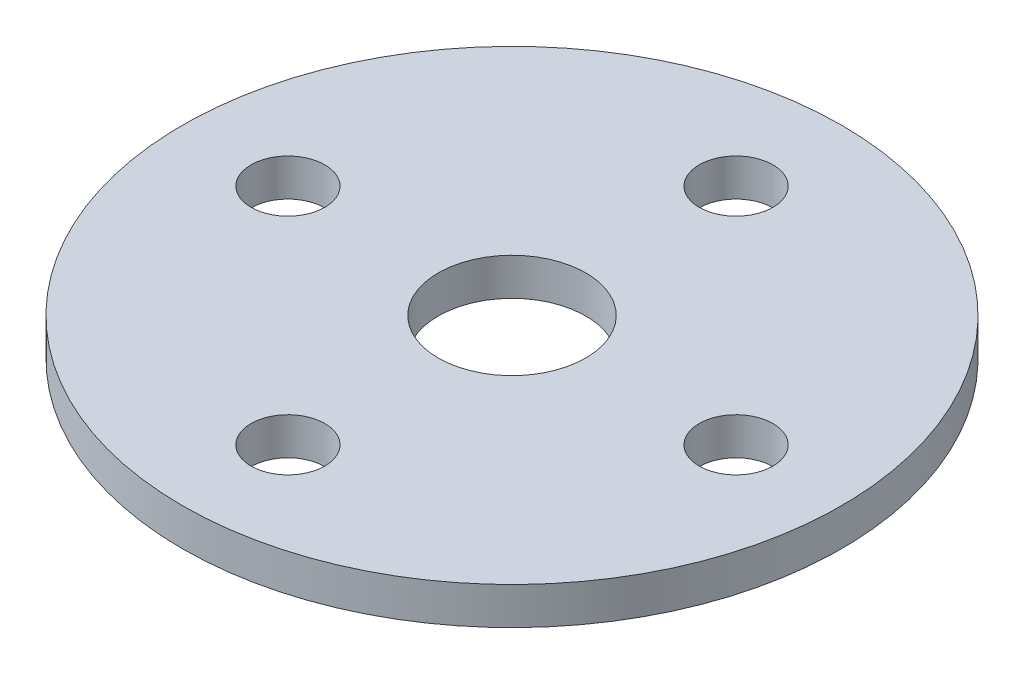
ISO-10303-21;
HEADER;
FILE_DESCRIPTION(('STEP AP214'),'2;1');
FILE_NAME('part.step','',(''),(''),'','','');
FILE_SCHEMA(('AUTOMOTIVE_DESIGN { 1 0 10303 214 1 1 1 1 }'));
ENDSEC;
DATA;
#1=APPLICATION_CONTEXT('core data for automotive mechanical design processes');
#2=APPLICATION_PROTOCOL_DEFINITION('international standard','automotive_design',2000,#1);
#3=PRODUCT_CONTEXT('',#1,'mechanical');
#4=PRODUCT('Part','Part','',(#3));
#5=PRODUCT_RELATED_PRODUCT_CATEGORY('part','',(#4));
#6=PRODUCT_DEFINITION_FORMATION('','',#4);
#7=PRODUCT_DEFINITION_CONTEXT('part definition',#1,'design');
#8=PRODUCT_DEFINITION('design','',#6,#7);
#9=PRODUCT_DEFINITION_SHAPE('','',#8);
#10=(LENGTH_UNIT() NAMED_UNIT(*) SI_UNIT(.MILLI.,.METRE.));
#11=(NAMED_UNIT(*) PLANE_ANGLE_UNIT() SI_UNIT($,.RADIAN.));
#12=(NAMED_UNIT(*) SI_UNIT($,.STERADIAN.) SOLID_ANGLE_UNIT());
#13=UNCERTAINTY_MEASURE_WITH_UNIT(LENGTH_MEASURE(1.E-05),#10,'distance_accuracy_value','');
#14=(GEOMETRIC_REPRESENTATION_CONTEXT(3) GLOBAL_UNCERTAINTY_ASSIGNED_CONTEXT((#13)) GLOBAL_UNIT_ASSIGNED_CONTEXT((#10,
#11,#12)) REPRESENTATION_CONTEXT('',''));
#15=CARTESIAN_POINT('',(0.,0.,0.));
#16=DIRECTION('',(0.,0.,1.));
#17=DIRECTION('',(1.,0.,0.));
#18=AXIS2_PLACEMENT_3D('',#15,#16,#17);
#19=CARTESIAN_POINT('',(0.,2.,0.));
#20=DIRECTION('',(0.,1.,0.));
#21=DIRECTION('',(0.,0.,1.));
#22=AXIS2_PLACEMENT_3D('',#19,#20,#21);
#23=PLANE('',#22);
#24=CARTESIAN_POINT('',(12.,2.,0.));
#25=DIRECTION('',(0.,1.,0.));
#26=DIRECTION('',(0.,0.,-1.));
#27=AXIS2_PLACEMENT_3D('',#24,#25,#26);
#28=CIRCLE('',#27,1.975);
#29=CARTESIAN_POINT('',(12.,2.,-1.975));
#30=VERTEX_POINT('',#29);
#31=EDGE_CURVE('E62',#30,#30,#28,.T.);
#32=ORIENTED_EDGE('',*,*,#31,.F.);
#33=EDGE_LOOP('',(#32));
#34=FACE_BOUND('',#33,.T.);
#35=CARTESIAN_POINT('',(0.,2.,-12.));
#36=DIRECTION('',(0.,1.,0.));
#37=DIRECTION('',(0.,0.,1.));
#38=AXIS2_PLACEMENT_3D('',#35,#36,#37);
#39=CIRCLE('',#38,1.975);
#40=CARTESIAN_POINT('',(0.,2.,-10.025));
#41=VERTEX_POINT('',#40);
#42=EDGE_CURVE('E50',#41,#41,#39,.T.);
#43=ORIENTED_EDGE('',*,*,#42,.F.);
#44=EDGE_LOOP('',(#43));
#45=FACE_BOUND('',#44,.T.);
#46=CARTESIAN_POINT('',(0.,2.,0.));
#47=DIRECTION('',(0.,1.,0.));
#48=DIRECTION('',(0.,0.,1.));
#49=AXIS2_PLACEMENT_3D('',#46,#47,#48);
#50=CIRCLE('',#49,17.65);
#51=CARTESIAN_POINT('',(0.,2.,17.65));
#52=VERTEX_POINT('',#51);
#53=EDGE_CURVE('E10',#52,#52,#50,.T.);
#54=ORIENTED_EDGE('',*,*,#53,.T.);
#55=EDGE_LOOP('',(#54));
#56=FACE_BOUND('',#55,.T.);
#57=CARTESIAN_POINT('',(0.,2.,0.));
#58=DIRECTION('',(0.,1.,0.));
#59=DIRECTION('',(0.,0.,1.));
#60=AXIS2_PLACEMENT_3D('',#57,#58,#59);
#61=CIRCLE('',#60,3.95);
#62=CARTESIAN_POINT('',(0.,2.,3.95));
#63=VERTEX_POINT('',#62);
#64=EDGE_CURVE('E45',#63,#63,#61,.T.);
#65=ORIENTED_EDGE('',*,*,#64,.F.);
#66=EDGE_LOOP('',(#65));
#67=FACE_BOUND('',#66,.T.);
#68=CARTESIAN_POINT('',(-12.,2.,0.));
#69=DIRECTION('',(0.,1.,0.));
#70=DIRECTION('',(0.,0.,1.));
#71=AXIS2_PLACEMENT_3D('',#68,#69,#70);
#72=CIRCLE('',#71,1.975);
#73=CARTESIAN_POINT('',(-12.,2.,1.975));
#74=VERTEX_POINT('',#73);
#75=EDGE_CURVE('E56',#74,#74,#72,.T.);
#76=ORIENTED_EDGE('',*,*,#75,.F.);
#77=EDGE_LOOP('',(#76));
#78=FACE_BOUND('',#77,.T.);
#79=CARTESIAN_POINT('',(0.,2.,12.));
#80=DIRECTION('',(0.,1.,0.));
#81=DIRECTION('',(0.,0.,-1.));
#82=AXIS2_PLACEMENT_3D('',#79,#80,#81);
#83=CIRCLE('',#82,1.975);
#84=CARTESIAN_POINT('',(0.,2.,10.025));
#85=VERTEX_POINT('',#84);
#86=EDGE_CURVE('E68',#85,#85,#83,.T.);
#87=ORIENTED_EDGE('',*,*,#86,.F.);
#88=EDGE_LOOP('',(#87));
#89=FACE_BOUND('',#88,.T.);
#90=ADVANCED_FACE('F34',(#34,#45,#56,#67,#78,#89),#23,.T.);
#91=CARTESIAN_POINT('',(0.,0.,0.));
#92=DIRECTION('',(0.,1.,0.));
#93=DIRECTION('',(0.,0.,1.));
#94=AXIS2_PLACEMENT_3D('',#91,#92,#93);
#95=PLANE('',#94);
#96=CARTESIAN_POINT('',(0.,0.,0.));
#97=DIRECTION('',(0.,1.,0.));
#98=DIRECTION('',(0.,0.,1.));
#99=AXIS2_PLACEMENT_3D('',#96,#97,#98);
#100=CIRCLE('',#99,17.65);
#101=CARTESIAN_POINT('',(0.,0.,17.65));
#102=VERTEX_POINT('',#101);
#103=EDGE_CURVE('E38',#102,#102,#100,.T.);
#104=ORIENTED_EDGE('',*,*,#103,.F.);
#105=EDGE_LOOP('',(#104));
#106=FACE_BOUND('',#105,.T.);
#107=CARTESIAN_POINT('',(0.,0.,0.));
#108=DIRECTION('',(0.,1.,0.));
#109=DIRECTION('',(0.,0.,1.));
#110=AXIS2_PLACEMENT_3D('',#107,#108,#109);
#111=CIRCLE('',#110,3.95);
#112=CARTESIAN_POINT('',(0.,0.,3.95));
#113=VERTEX_POINT('',#112);
#114=EDGE_CURVE('E47',#113,#113,#111,.T.);
#115=ORIENTED_EDGE('',*,*,#114,.T.);
#116=EDGE_LOOP('',(#115));
#117=FACE_BOUND('',#116,.T.);
#118=CARTESIAN_POINT('',(0.,0.,-12.));
#119=DIRECTION('',(0.,1.,0.));
#120=DIRECTION('',(0.,0.,1.));
#121=AXIS2_PLACEMENT_3D('',#118,#119,#120);
#122=CIRCLE('',#121,1.975);
#123=CARTESIAN_POINT('',(0.,0.,-10.025));
#124=VERTEX_POINT('',#123);
#125=EDGE_CURVE('E53',#124,#124,#122,.T.);
#126=ORIENTED_EDGE('',*,*,#125,.T.);
#127=EDGE_LOOP('',(#126));
#128=FACE_BOUND('',#127,.T.);
#129=CARTESIAN_POINT('',(-12.,0.,0.));
#130=DIRECTION('',(0.,1.,0.));
#131=DIRECTION('',(0.,0.,1.));
#132=AXIS2_PLACEMENT_3D('',#129,#130,#131);
#133=CIRCLE('',#132,1.975);
#134=CARTESIAN_POINT('',(-12.,0.,1.975));
#135=VERTEX_POINT('',#134);
#136=EDGE_CURVE('E59',#135,#135,#133,.T.);
#137=ORIENTED_EDGE('',*,*,#136,.T.);
#138=EDGE_LOOP('',(#137));
#139=FACE_BOUND('',#138,.T.);
#140=CARTESIAN_POINT('',(12.,0.,0.));
#141=DIRECTION('',(0.,1.,0.));
#142=DIRECTION('',(0.,0.,-1.));
#143=AXIS2_PLACEMENT_3D('',#140,#141,#142);
#144=CIRCLE('',#143,1.975);
#145=CARTESIAN_POINT('',(12.,0.,-1.975));
#146=VERTEX_POINT('',#145);
#147=EDGE_CURVE('E65',#146,#146,#144,.T.);
#148=ORIENTED_EDGE('',*,*,#147,.T.);
#149=EDGE_LOOP('',(#148));
#150=FACE_BOUND('',#149,.T.);
#151=CARTESIAN_POINT('',(0.,0.,12.));
#152=DIRECTION('',(0.,1.,0.));
#153=DIRECTION('',(0.,0.,-1.));
#154=AXIS2_PLACEMENT_3D('',#151,#152,#153);
#155=CIRCLE('',#154,1.975);
#156=CARTESIAN_POINT('',(0.,0.,10.025));
#157=VERTEX_POINT('',#156);
#158=EDGE_CURVE('E71',#157,#157,#155,.T.);
#159=ORIENTED_EDGE('',*,*,#158,.T.);
#160=EDGE_LOOP('',(#159));
#161=FACE_BOUND('',#160,.T.);
#162=ADVANCED_FACE('F81',(#106,#117,#128,#139,#150,#161),#95,.F.);
#163=CARTESIAN_POINT('',(0.,2.,0.));
#164=DIRECTION('',(0.,-1.,0.));
#165=DIRECTION('',(0.,0.,-1.));
#166=AXIS2_PLACEMENT_3D('',#163,#164,#165);
#167=CYLINDRICAL_SURFACE('',#166,17.65);
#168=ORIENTED_EDGE('',*,*,#53,.F.);
#169=EDGE_LOOP('',(#168));
#170=FACE_BOUND('',#169,.T.);
#171=ORIENTED_EDGE('',*,*,#103,.T.);
#172=EDGE_LOOP('',(#171));
#173=FACE_BOUND('',#172,.T.);
#174=ADVANCED_FACE('F36',(#170,#173),#167,.T.);
#175=CARTESIAN_POINT('',(0.,2.,0.));
#176=DIRECTION('',(0.,-1.,0.));
#177=DIRECTION('',(0.,0.,-1.));
#178=AXIS2_PLACEMENT_3D('',#175,#176,#177);
#179=CYLINDRICAL_SURFACE('',#178,3.95);
#180=ORIENTED_EDGE('',*,*,#64,.T.);
#181=EDGE_LOOP('',(#180));
#182=FACE_BOUND('',#181,.T.);
#183=ORIENTED_EDGE('',*,*,#114,.F.);
#184=EDGE_LOOP('',(#183));
#185=FACE_BOUND('',#184,.T.);
#186=ADVANCED_FACE('F91',(#182,#185),#179,.F.);
#187=CARTESIAN_POINT('',(0.,2.,-12.));
#188=DIRECTION('',(0.,-1.,0.));
#189=DIRECTION('',(0.,0.,-1.));
#190=AXIS2_PLACEMENT_3D('',#187,#188,#189);
#191=CYLINDRICAL_SURFACE('',#190,1.975);
#192=ORIENTED_EDGE('',*,*,#42,.T.);
#193=EDGE_LOOP('',(#192));
#194=FACE_BOUND('',#193,.T.);
#195=ORIENTED_EDGE('',*,*,#125,.F.);
#196=EDGE_LOOP('',(#195));
#197=FACE_BOUND('',#196,.T.);
#198=ADVANCED_FACE('F94',(#194,#197),#191,.F.);
#199=CARTESIAN_POINT('',(-12.,2.,0.));
#200=DIRECTION('',(0.,-1.,0.));
#201=DIRECTION('',(0.,0.,-1.));
#202=AXIS2_PLACEMENT_3D('',#199,#200,#201);
#203=CYLINDRICAL_SURFACE('',#202,1.975);
#204=ORIENTED_EDGE('',*,*,#75,.T.);
#205=EDGE_LOOP('',(#204));
#206=FACE_BOUND('',#205,.T.);
#207=ORIENTED_EDGE('',*,*,#136,.F.);
#208=EDGE_LOOP('',(#207));
#209=FACE_BOUND('',#208,.T.);
#210=ADVANCED_FACE('F98',(#206,#209),#203,.F.);
#211=CARTESIAN_POINT('',(12.,2.,0.));
#212=DIRECTION('',(0.,-1.,0.));
#213=DIRECTION('',(0.,0.,-1.));
#214=AXIS2_PLACEMENT_3D('',#211,#212,#213);
#215=CYLINDRICAL_SURFACE('',#214,1.975);
#216=ORIENTED_EDGE('',*,*,#31,.T.);
#217=EDGE_LOOP('',(#216));
#218=FACE_BOUND('',#217,.T.);
#219=ORIENTED_EDGE('',*,*,#147,.F.);
#220=EDGE_LOOP('',(#219));
#221=FACE_BOUND('',#220,.T.);
#222=ADVANCED_FACE('F102',(#218,#221),#215,.F.);
#223=CARTESIAN_POINT('',(0.,2.,12.));
#224=DIRECTION('',(0.,-1.,0.));
#225=DIRECTION('',(0.,0.,-1.));
#226=AXIS2_PLACEMENT_3D('',#223,#224,#225);
#227=CYLINDRICAL_SURFACE('',#226,1.975);
#228=ORIENTED_EDGE('',*,*,#86,.T.);
#229=EDGE_LOOP('',(#228));
#230=FACE_BOUND('',#229,.T.);
#231=ORIENTED_EDGE('',*,*,#158,.F.);
#232=EDGE_LOOP('',(#231));
#233=FACE_BOUND('',#232,.T.);
#234=ADVANCED_FACE('F77',(#230,#233),#227,.F.);
#235=CLOSED_SHELL('',(#90,#162,#174,#186,#198,#210,#222,#234));
#236=MANIFOLD_SOLID_BREP('B2',#235);
#237=ADVANCED_BREP_SHAPE_REPRESENTATION('',(#18,#236),#14);
#238=SHAPE_DEFINITION_REPRESENTATION(#9,#237);
ENDSEC;
END-ISO-10303-21;
